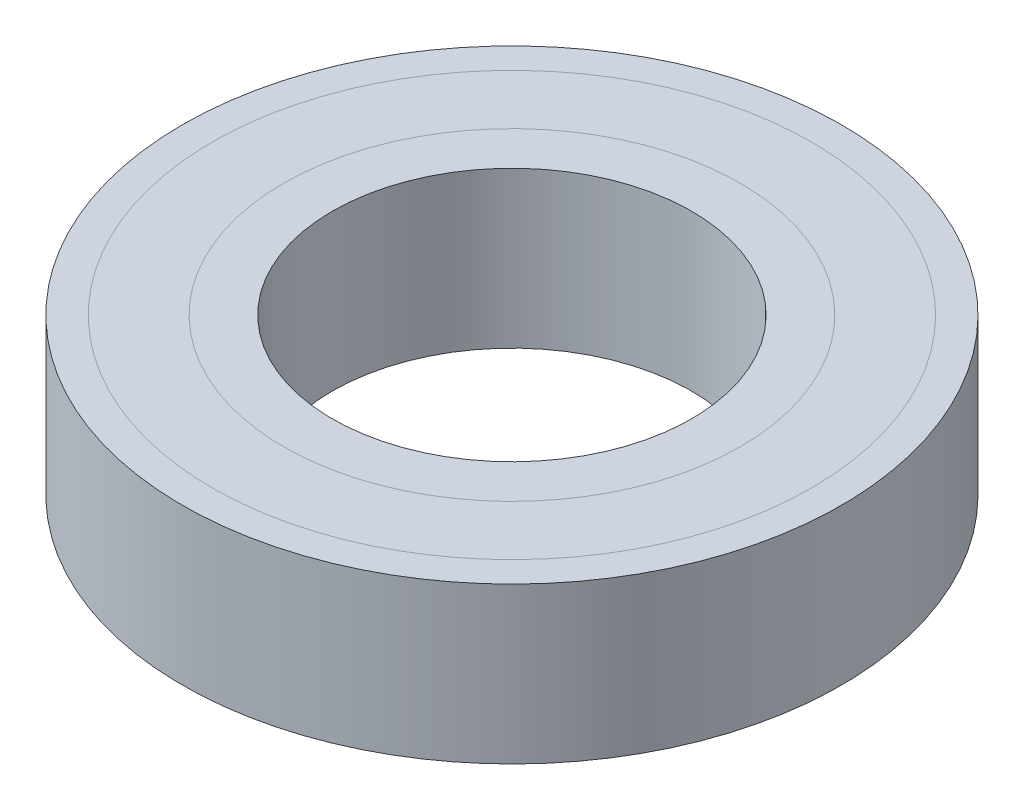
ISO-10303-21;
HEADER;
FILE_DESCRIPTION(('STEP AP214'),'2;1');
FILE_NAME('part.step','',(''),(''),'','','');
FILE_SCHEMA(('AUTOMOTIVE_DESIGN { 1 0 10303 214 1 1 1 1 }'));
ENDSEC;
DATA;
#1=APPLICATION_CONTEXT('core data for automotive mechanical design processes');
#2=APPLICATION_PROTOCOL_DEFINITION('international standard','automotive_design',2000,#1);
#3=PRODUCT_CONTEXT('',#1,'mechanical');
#4=PRODUCT('Part','Part','',(#3));
#5=PRODUCT_RELATED_PRODUCT_CATEGORY('part','',(#4));
#6=PRODUCT_DEFINITION_FORMATION('','',#4);
#7=PRODUCT_DEFINITION_CONTEXT('part definition',#1,'design');
#8=PRODUCT_DEFINITION('design','',#6,#7);
#9=PRODUCT_DEFINITION_SHAPE('','',#8);
#10=(LENGTH_UNIT() NAMED_UNIT(*) SI_UNIT(.MILLI.,.METRE.));
#11=(NAMED_UNIT(*) PLANE_ANGLE_UNIT() SI_UNIT($,.RADIAN.));
#12=(NAMED_UNIT(*) SI_UNIT($,.STERADIAN.) SOLID_ANGLE_UNIT());
#13=UNCERTAINTY_MEASURE_WITH_UNIT(LENGTH_MEASURE(1.E-05),#10,'distance_accuracy_value','');
#14=(GEOMETRIC_REPRESENTATION_CONTEXT(3) GLOBAL_UNCERTAINTY_ASSIGNED_CONTEXT((#13)) GLOBAL_UNIT_ASSIGNED_CONTEXT((#10,
#11,#12)) REPRESENTATION_CONTEXT('',''));
#15=CARTESIAN_POINT('',(0.,0.,0.));
#16=DIRECTION('',(0.,0.,1.));
#17=DIRECTION('',(1.,0.,0.));
#18=AXIS2_PLACEMENT_3D('',#15,#16,#17);
#19=CARTESIAN_POINT('',(15.,-6.5,0.));
#20=DIRECTION('',(0.,1.,0.));
#21=DIRECTION('',(-1.,0.,0.));
#22=AXIS2_PLACEMENT_3D('',#19,#20,#21);
#23=PLANE('',#22);
#24=CARTESIAN_POINT('',(0.,-6.50000000000001,0.));
#25=DIRECTION('',(0.,1.,0.));
#26=DIRECTION('',(-1.,0.,0.));
#27=AXIS2_PLACEMENT_3D('',#24,#25,#26);
#28=CIRCLE('',#27,25.);
#29=CARTESIAN_POINT('',(-25.,-6.50000000000001,0.));
#30=VERTEX_POINT('',#29);
#31=EDGE_CURVE('E58',#30,#30,#28,.F.);
#32=ORIENTED_EDGE('',*,*,#31,.T.);
#33=EDGE_LOOP('',(#32));
#34=FACE_BOUND('',#33,.T.);
#35=CARTESIAN_POINT('',(0.,-6.50000000000001,0.));
#36=DIRECTION('',(0.,1.,0.));
#37=DIRECTION('',(-1.,0.,0.));
#38=AXIS2_PLACEMENT_3D('',#35,#36,#37);
#39=CIRCLE('',#38,19.05);
#40=CARTESIAN_POINT('',(-19.05,-6.50000000000001,0.));
#41=VERTEX_POINT('',#40);
#42=EDGE_CURVE('E10',#41,#41,#39,.F.);
#43=ORIENTED_EDGE('',*,*,#42,.F.);
#44=EDGE_LOOP('',(#43));
#45=FACE_BOUND('',#44,.T.);
#46=ADVANCED_FACE('F41',(#34,#45),#23,.F.);
#47=CARTESIAN_POINT('',(15.,6.5,0.));
#48=DIRECTION('',(0.,-1.,0.));
#49=DIRECTION('',(1.,0.,0.));
#50=AXIS2_PLACEMENT_3D('',#47,#48,#49);
#51=PLANE('',#50);
#52=CARTESIAN_POINT('',(0.,6.49999999999999,0.));
#53=DIRECTION('',(0.,-1.,0.));
#54=DIRECTION('',(1.,0.,0.));
#55=AXIS2_PLACEMENT_3D('',#52,#53,#54);
#56=CIRCLE('',#55,25.);
#57=CARTESIAN_POINT('',(25.,6.5,0.));
#58=VERTEX_POINT('',#57);
#59=EDGE_CURVE('E60',#58,#58,#56,.F.);
#60=ORIENTED_EDGE('',*,*,#59,.T.);
#61=EDGE_LOOP('',(#60));
#62=FACE_BOUND('',#61,.T.);
#63=CARTESIAN_POINT('',(0.,6.49999999999999,0.));
#64=DIRECTION('',(0.,-1.,0.));
#65=DIRECTION('',(1.,0.,0.));
#66=AXIS2_PLACEMENT_3D('',#63,#64,#65);
#67=CIRCLE('',#66,19.05);
#68=CARTESIAN_POINT('',(19.05,6.5,0.));
#69=VERTEX_POINT('',#68);
#70=EDGE_CURVE('E45',#69,#69,#67,.F.);
#71=ORIENTED_EDGE('',*,*,#70,.F.);
#72=EDGE_LOOP('',(#71));
#73=FACE_BOUND('',#72,.T.);
#74=ADVANCED_FACE('F89',(#62,#73),#51,.F.);
#75=CARTESIAN_POINT('',(0.,-6.50000000000001,0.));
#76=DIRECTION('',(0.,1.,0.));
#77=DIRECTION('',(-1.,0.,0.));
#78=AXIS2_PLACEMENT_3D('',#75,#76,#77);
#79=CIRCLE('',#78,27.5);
#80=CARTESIAN_POINT('',(-27.5,-6.50000000000002,0.));
#81=VERTEX_POINT('',#80);
#82=EDGE_CURVE('E63',#81,#81,#79,.T.);
#83=ORIENTED_EDGE('',*,*,#82,.F.);
#84=EDGE_LOOP('',(#83));
#85=FACE_BOUND('',#84,.T.);
#86=ORIENTED_EDGE('',*,*,#31,.F.);
#87=EDGE_LOOP('',(#86));
#88=FACE_BOUND('',#87,.T.);
#89=ADVANCED_FACE('F86',(#85,#88),#23,.F.);
#90=CARTESIAN_POINT('',(0.,6.49999999999999,0.));
#91=DIRECTION('',(0.,1.,0.));
#92=DIRECTION('',(-1.,0.,0.));
#93=AXIS2_PLACEMENT_3D('',#90,#91,#92);
#94=CIRCLE('',#93,27.5);
#95=CARTESIAN_POINT('',(-27.5,6.49999999999998,0.));
#96=VERTEX_POINT('',#95);
#97=EDGE_CURVE('E74',#96,#96,#94,.T.);
#98=ORIENTED_EDGE('',*,*,#97,.T.);
#99=EDGE_LOOP('',(#98));
#100=FACE_BOUND('',#99,.T.);
#101=ORIENTED_EDGE('',*,*,#59,.F.);
#102=EDGE_LOOP('',(#101));
#103=FACE_BOUND('',#102,.T.);
#104=ADVANCED_FACE('F78',(#100,#103),#51,.F.);
#105=CARTESIAN_POINT('',(0.,6.5,0.));
#106=DIRECTION('',(0.,1.,0.));
#107=DIRECTION('',(-1.,0.,0.));
#108=AXIS2_PLACEMENT_3D('',#105,#106,#107);
#109=CYLINDRICAL_SURFACE('',#108,27.5);
#110=ORIENTED_EDGE('',*,*,#97,.F.);
#111=EDGE_LOOP('',(#110));
#112=FACE_BOUND('',#111,.T.);
#113=ORIENTED_EDGE('',*,*,#82,.T.);
#114=EDGE_LOOP('',(#113));
#115=FACE_BOUND('',#114,.T.);
#116=ADVANCED_FACE('F43',(#112,#115),#109,.T.);
#117=ORIENTED_EDGE('',*,*,#42,.T.);
#118=EDGE_LOOP('',(#117));
#119=FACE_BOUND('',#118,.T.);
#120=CARTESIAN_POINT('',(0.,-6.5,0.));
#121=DIRECTION('',(0.,1.,0.));
#122=DIRECTION('',(-1.,0.,0.));
#123=AXIS2_PLACEMENT_3D('',#120,#121,#122);
#124=CIRCLE('',#123,15.);
#125=CARTESIAN_POINT('',(-15.,-6.50000000000001,0.));
#126=VERTEX_POINT('',#125);
#127=EDGE_CURVE('E68',#126,#126,#124,.T.);
#128=ORIENTED_EDGE('',*,*,#127,.T.);
#129=EDGE_LOOP('',(#128));
#130=FACE_BOUND('',#129,.T.);
#131=ADVANCED_FACE('F83',(#119,#130),#23,.F.);
#132=CARTESIAN_POINT('',(0.,6.5,0.));
#133=DIRECTION('',(0.,1.,0.));
#134=DIRECTION('',(-1.,0.,0.));
#135=AXIS2_PLACEMENT_3D('',#132,#133,#134);
#136=CYLINDRICAL_SURFACE('',#135,15.);
#137=ORIENTED_EDGE('',*,*,#127,.F.);
#138=EDGE_LOOP('',(#137));
#139=FACE_BOUND('',#138,.T.);
#140=CARTESIAN_POINT('',(0.,6.49999999999999,0.));
#141=DIRECTION('',(0.,1.,0.));
#142=DIRECTION('',(-1.,0.,0.));
#143=AXIS2_PLACEMENT_3D('',#140,#141,#142);
#144=CIRCLE('',#143,15.);
#145=CARTESIAN_POINT('',(-15.,6.49999999999999,0.));
#146=VERTEX_POINT('',#145);
#147=EDGE_CURVE('E71',#146,#146,#144,.T.);
#148=ORIENTED_EDGE('',*,*,#147,.T.);
#149=EDGE_LOOP('',(#148));
#150=FACE_BOUND('',#149,.T.);
#151=ADVANCED_FACE('F103',(#139,#150),#136,.F.);
#152=ORIENTED_EDGE('',*,*,#70,.T.);
#153=EDGE_LOOP('',(#152));
#154=FACE_BOUND('',#153,.T.);
#155=ORIENTED_EDGE('',*,*,#147,.F.);
#156=EDGE_LOOP('',(#155));
#157=FACE_BOUND('',#156,.T.);
#158=ADVANCED_FACE('F100',(#154,#157),#51,.F.);
#159=CLOSED_SHELL('',(#46,#74,#89,#104,#116,#131,#151,#158));
#160=MANIFOLD_SOLID_BREP('B2',#159);
#161=ADVANCED_BREP_SHAPE_REPRESENTATION('',(#18,#160),#14);
#162=SHAPE_DEFINITION_REPRESENTATION(#9,#161);
ENDSEC;
END-ISO-10303-21;
